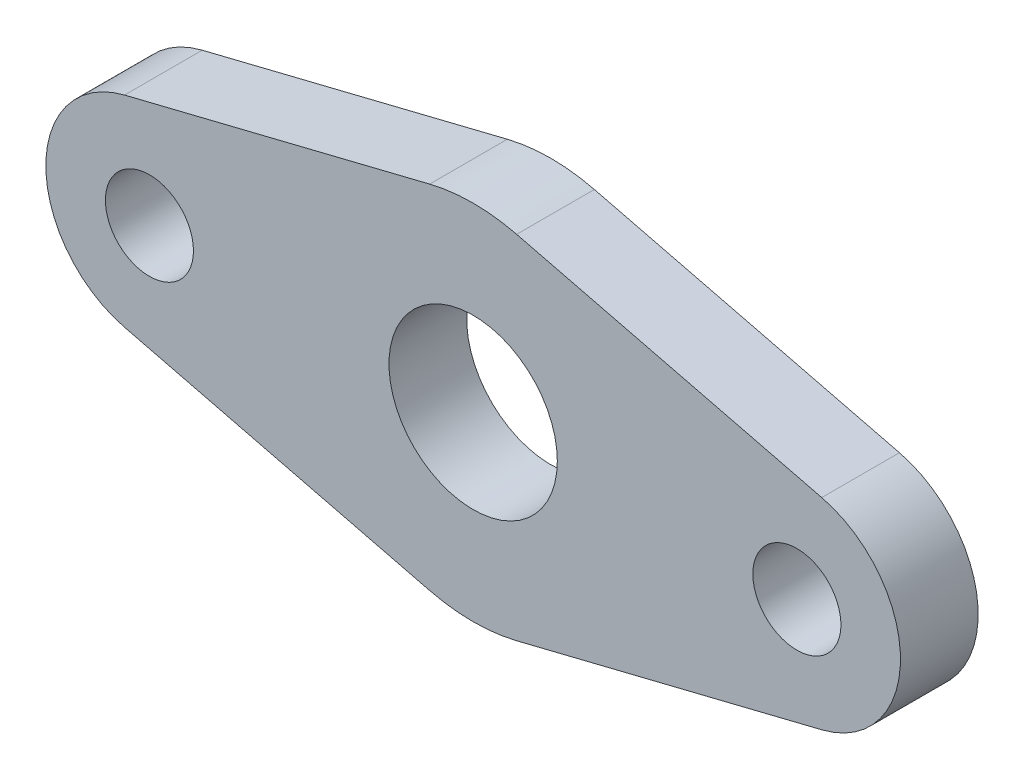
ISO-10303-21;
HEADER;
FILE_DESCRIPTION(('STEP AP214'),'2;1');
FILE_NAME('part.step','',(''),(''),'','','');
FILE_SCHEMA(('AUTOMOTIVE_DESIGN { 1 0 10303 214 1 1 1 1 }'));
ENDSEC;
DATA;
#1=APPLICATION_CONTEXT('core data for automotive mechanical design processes');
#2=APPLICATION_PROTOCOL_DEFINITION('international standard','automotive_design',2000,#1);
#3=PRODUCT_CONTEXT('',#1,'mechanical');
#4=PRODUCT('Part','Part','',(#3));
#5=PRODUCT_RELATED_PRODUCT_CATEGORY('part','',(#4));
#6=PRODUCT_DEFINITION_FORMATION('','',#4);
#7=PRODUCT_DEFINITION_CONTEXT('part definition',#1,'design');
#8=PRODUCT_DEFINITION('design','',#6,#7);
#9=PRODUCT_DEFINITION_SHAPE('','',#8);
#10=(LENGTH_UNIT() NAMED_UNIT(*) SI_UNIT(.MILLI.,.METRE.));
#11=(NAMED_UNIT(*) PLANE_ANGLE_UNIT() SI_UNIT($,.RADIAN.));
#12=(NAMED_UNIT(*) SI_UNIT($,.STERADIAN.) SOLID_ANGLE_UNIT());
#13=UNCERTAINTY_MEASURE_WITH_UNIT(LENGTH_MEASURE(1.E-05),#10,'distance_accuracy_value','');
#14=(GEOMETRIC_REPRESENTATION_CONTEXT(3) GLOBAL_UNCERTAINTY_ASSIGNED_CONTEXT((#13)) GLOBAL_UNIT_ASSIGNED_CONTEXT((#10,
#11,#12)) REPRESENTATION_CONTEXT('',''));
#15=CARTESIAN_POINT('',(0.,0.,0.));
#16=DIRECTION('',(0.,0.,1.));
#17=DIRECTION('',(1.,0.,0.));
#18=AXIS2_PLACEMENT_3D('',#15,#16,#17);
#19=CARTESIAN_POINT('',(-12.5,0.,3.));
#20=DIRECTION('',(0.,0.,1.));
#21=DIRECTION('',(1.,0.,0.));
#22=AXIS2_PLACEMENT_3D('',#19,#20,#21);
#23=PLANE('',#22);
#24=CARTESIAN_POINT('',(-12.5,0.,3.));
#25=DIRECTION('',(0.,0.,1.));
#26=DIRECTION('',(1.,0.,0.));
#27=AXIS2_PLACEMENT_3D('',#24,#25,#26);
#28=CIRCLE('',#27,1.7);
#29=CARTESIAN_POINT('',(-10.8,0.,3.));
#30=VERTEX_POINT('',#29);
#31=EDGE_CURVE('E213',#30,#30,#28,.T.);
#32=ORIENTED_EDGE('',*,*,#31,.F.);
#33=EDGE_LOOP('',(#32));
#34=FACE_BOUND('',#33,.T.);
#35=CARTESIAN_POINT('',(-12.5,0.,3.));
#36=DIRECTION('',(0.,0.,1.));
#37=DIRECTION('',(1.,0.,0.));
#38=AXIS2_PLACEMENT_3D('',#35,#36,#37);
#39=CIRCLE('',#38,3.99999999999999);
#40=CARTESIAN_POINT('',(-13.46,3.8830915518437,3.));
#41=VERTEX_POINT('',#40);
#42=CARTESIAN_POINT('',(-13.46,-3.8830915518437,3.));
#43=VERTEX_POINT('',#42);
#44=EDGE_CURVE('E164',#41,#43,#39,.T.);
#45=ORIENTED_EDGE('',*,*,#44,.T.);
#46=DIRECTION('',(0.970772887960928,-0.24,0.));
#47=VECTOR('',#46,1.);
#48=CARTESIAN_POINT('',(-13.46,-3.8830915518437,3.));
#49=LINE('',#48,#47);
#50=CARTESIAN_POINT('',(-1.68,-6.79541021572649,3.));
#51=VERTEX_POINT('',#50);
#52=EDGE_CURVE('E100',#43,#51,#49,.T.);
#53=ORIENTED_EDGE('',*,*,#52,.T.);
#54=CARTESIAN_POINT('',(0.,0.,3.));
#55=DIRECTION('',(0.,0.,1.));
#56=DIRECTION('',(-1.,0.,0.));
#57=AXIS2_PLACEMENT_3D('',#54,#55,#56);
#58=CIRCLE('',#57,7.);
#59=CARTESIAN_POINT('',(1.68,-6.79541021572649,3.));
#60=VERTEX_POINT('',#59);
#61=EDGE_CURVE('E185',#51,#60,#58,.T.);
#62=ORIENTED_EDGE('',*,*,#61,.T.);
#63=DIRECTION('',(0.970772887960928,0.240000000000001,0.));
#64=VECTOR('',#63,1.);
#65=CARTESIAN_POINT('',(13.46,-3.8830915518437,3.));
#66=LINE('',#65,#64);
#67=CARTESIAN_POINT('',(13.46,-3.8830915518437,3.));
#68=VERTEX_POINT('',#67);
#69=EDGE_CURVE('E199',#60,#68,#66,.T.);
#70=ORIENTED_EDGE('',*,*,#69,.T.);
#71=CARTESIAN_POINT('',(12.5,0.,3.));
#72=DIRECTION('',(0.,0.,1.));
#73=DIRECTION('',(-1.,0.,0.));
#74=AXIS2_PLACEMENT_3D('',#71,#72,#73);
#75=CIRCLE('',#74,3.99999999999999);
#76=CARTESIAN_POINT('',(13.46,3.8830915518437,3.));
#77=VERTEX_POINT('',#76);
#78=EDGE_CURVE('E119',#68,#77,#75,.T.);
#79=ORIENTED_EDGE('',*,*,#78,.T.);
#80=DIRECTION('',(-0.970772887960928,0.24,0.));
#81=VECTOR('',#80,1.);
#82=CARTESIAN_POINT('',(13.46,3.8830915518437,3.));
#83=LINE('',#82,#81);
#84=CARTESIAN_POINT('',(1.68,6.79541021572649,3.));
#85=VERTEX_POINT('',#84);
#86=EDGE_CURVE('E113',#77,#85,#83,.T.);
#87=ORIENTED_EDGE('',*,*,#86,.T.);
#88=CARTESIAN_POINT('',(0.,0.,3.));
#89=DIRECTION('',(0.,0.,1.));
#90=DIRECTION('',(1.,0.,0.));
#91=AXIS2_PLACEMENT_3D('',#88,#89,#90);
#92=CIRCLE('',#91,6.99999999999999);
#93=CARTESIAN_POINT('',(-1.68,6.79541021572649,3.));
#94=VERTEX_POINT('',#93);
#95=EDGE_CURVE('E117',#85,#94,#92,.T.);
#96=ORIENTED_EDGE('',*,*,#95,.T.);
#97=DIRECTION('',(-0.970772887960928,-0.24,0.));
#98=VECTOR('',#97,1.);
#99=CARTESIAN_POINT('',(-13.46,3.8830915518437,3.));
#100=LINE('',#99,#98);
#101=EDGE_CURVE('E57',#94,#41,#100,.T.);
#102=ORIENTED_EDGE('',*,*,#101,.T.);
#103=EDGE_LOOP('',(#45,#53,#62,#70,#79,#87,#96,#102));
#104=FACE_BOUND('',#103,.T.);
#105=CARTESIAN_POINT('',(0.,0.,3.));
#106=DIRECTION('',(0.,0.,1.));
#107=DIRECTION('',(1.,0.,0.));
#108=AXIS2_PLACEMENT_3D('',#105,#106,#107);
#109=CIRCLE('',#108,3.25);
#110=CARTESIAN_POINT('',(3.25,0.,3.));
#111=VERTEX_POINT('',#110);
#112=EDGE_CURVE('E146',#111,#111,#109,.T.);
#113=ORIENTED_EDGE('',*,*,#112,.F.);
#114=EDGE_LOOP('',(#113));
#115=FACE_BOUND('',#114,.T.);
#116=CARTESIAN_POINT('',(12.5,0.,3.));
#117=DIRECTION('',(0.,0.,1.));
#118=DIRECTION('',(-1.,0.,0.));
#119=AXIS2_PLACEMENT_3D('',#116,#117,#118);
#120=CIRCLE('',#119,1.7);
#121=CARTESIAN_POINT('',(10.8,0.,3.));
#122=VERTEX_POINT('',#121);
#123=EDGE_CURVE('E221',#122,#122,#120,.T.);
#124=ORIENTED_EDGE('',*,*,#123,.F.);
#125=EDGE_LOOP('',(#124));
#126=FACE_BOUND('',#125,.T.);
#127=ADVANCED_FACE('F39',(#34,#104,#115,#126),#23,.T.);
#128=CARTESIAN_POINT('',(-12.5,0.,0.));
#129=DIRECTION('',(0.,0.,1.));
#130=DIRECTION('',(1.,0.,0.));
#131=AXIS2_PLACEMENT_3D('',#128,#129,#130);
#132=PLANE('',#131);
#133=CARTESIAN_POINT('',(-12.5,0.,0.));
#134=DIRECTION('',(0.,0.,1.));
#135=DIRECTION('',(1.,0.,0.));
#136=AXIS2_PLACEMENT_3D('',#133,#134,#135);
#137=CIRCLE('',#136,3.99999999999999);
#138=CARTESIAN_POINT('',(-13.46,3.8830915518437,0.));
#139=VERTEX_POINT('',#138);
#140=CARTESIAN_POINT('',(-13.46,-3.8830915518437,0.));
#141=VERTEX_POINT('',#140);
#142=EDGE_CURVE('E141',#139,#141,#137,.T.);
#143=ORIENTED_EDGE('',*,*,#142,.F.);
#144=DIRECTION('',(-0.970772887960928,-0.24,0.));
#145=VECTOR('',#144,1.);
#146=CARTESIAN_POINT('',(-13.46,3.8830915518437,0.));
#147=LINE('',#146,#145);
#148=CARTESIAN_POINT('',(-1.68,6.79541021572649,0.));
#149=VERTEX_POINT('',#148);
#150=EDGE_CURVE('E92',#149,#139,#147,.T.);
#151=ORIENTED_EDGE('',*,*,#150,.F.);
#152=CARTESIAN_POINT('',(0.,0.,0.));
#153=DIRECTION('',(0.,0.,1.));
#154=DIRECTION('',(1.,0.,0.));
#155=AXIS2_PLACEMENT_3D('',#152,#153,#154);
#156=CIRCLE('',#155,6.99999999999999);
#157=CARTESIAN_POINT('',(1.68,6.79541021572649,0.));
#158=VERTEX_POINT('',#157);
#159=EDGE_CURVE('E86',#158,#149,#156,.T.);
#160=ORIENTED_EDGE('',*,*,#159,.F.);
#161=DIRECTION('',(-0.970772887960928,0.24,0.));
#162=VECTOR('',#161,1.);
#163=CARTESIAN_POINT('',(13.46,3.8830915518437,0.));
#164=LINE('',#163,#162);
#165=CARTESIAN_POINT('',(13.46,3.8830915518437,0.));
#166=VERTEX_POINT('',#165);
#167=EDGE_CURVE('E128',#166,#158,#164,.T.);
#168=ORIENTED_EDGE('',*,*,#167,.F.);
#169=CARTESIAN_POINT('',(12.5,0.,0.));
#170=DIRECTION('',(0.,0.,1.));
#171=DIRECTION('',(-1.,0.,0.));
#172=AXIS2_PLACEMENT_3D('',#169,#170,#171);
#173=CIRCLE('',#172,3.99999999999999);
#174=CARTESIAN_POINT('',(13.46,-3.8830915518437,0.));
#175=VERTEX_POINT('',#174);
#176=EDGE_CURVE('E155',#175,#166,#173,.T.);
#177=ORIENTED_EDGE('',*,*,#176,.F.);
#178=DIRECTION('',(0.970772887960928,0.240000000000001,0.));
#179=VECTOR('',#178,1.);
#180=CARTESIAN_POINT('',(13.46,-3.8830915518437,0.));
#181=LINE('',#180,#179);
#182=CARTESIAN_POINT('',(1.68,-6.79541021572649,0.));
#183=VERTEX_POINT('',#182);
#184=EDGE_CURVE('E152',#183,#175,#181,.T.);
#185=ORIENTED_EDGE('',*,*,#184,.F.);
#186=CARTESIAN_POINT('',(0.,0.,0.));
#187=DIRECTION('',(0.,0.,1.));
#188=DIRECTION('',(-1.,0.,0.));
#189=AXIS2_PLACEMENT_3D('',#186,#187,#188);
#190=CIRCLE('',#189,7.);
#191=CARTESIAN_POINT('',(-1.68,-6.79541021572649,0.));
#192=VERTEX_POINT('',#191);
#193=EDGE_CURVE('E149',#192,#183,#190,.T.);
#194=ORIENTED_EDGE('',*,*,#193,.F.);
#195=DIRECTION('',(0.970772887960928,-0.24,0.));
#196=VECTOR('',#195,1.);
#197=CARTESIAN_POINT('',(-13.46,-3.8830915518437,0.));
#198=LINE('',#197,#196);
#199=EDGE_CURVE('E145',#141,#192,#198,.T.);
#200=ORIENTED_EDGE('',*,*,#199,.F.);
#201=EDGE_LOOP('',(#143,#151,#160,#168,#177,#185,#194,#200));
#202=FACE_BOUND('',#201,.T.);
#203=CARTESIAN_POINT('',(0.,0.,0.));
#204=DIRECTION('',(0.,0.,1.));
#205=DIRECTION('',(1.,0.,0.));
#206=AXIS2_PLACEMENT_3D('',#203,#204,#205);
#207=CIRCLE('',#206,3.25);
#208=CARTESIAN_POINT('',(3.25,0.,0.));
#209=VERTEX_POINT('',#208);
#210=EDGE_CURVE('E209',#209,#209,#207,.T.);
#211=ORIENTED_EDGE('',*,*,#210,.T.);
#212=EDGE_LOOP('',(#211));
#213=FACE_BOUND('',#212,.T.);
#214=CARTESIAN_POINT('',(-12.5,0.,0.));
#215=DIRECTION('',(0.,0.,1.));
#216=DIRECTION('',(1.,0.,0.));
#217=AXIS2_PLACEMENT_3D('',#214,#215,#216);
#218=CIRCLE('',#217,1.7);
#219=CARTESIAN_POINT('',(-10.8,0.,0.));
#220=VERTEX_POINT('',#219);
#221=EDGE_CURVE('E217',#220,#220,#218,.T.);
#222=ORIENTED_EDGE('',*,*,#221,.T.);
#223=EDGE_LOOP('',(#222));
#224=FACE_BOUND('',#223,.T.);
#225=CARTESIAN_POINT('',(12.5,0.,0.));
#226=DIRECTION('',(0.,0.,1.));
#227=DIRECTION('',(-1.,0.,0.));
#228=AXIS2_PLACEMENT_3D('',#225,#226,#227);
#229=CIRCLE('',#228,1.7);
#230=CARTESIAN_POINT('',(10.8,0.,0.));
#231=VERTEX_POINT('',#230);
#232=EDGE_CURVE('E225',#231,#231,#229,.T.);
#233=ORIENTED_EDGE('',*,*,#232,.T.);
#234=EDGE_LOOP('',(#233));
#235=FACE_BOUND('',#234,.T.);
#236=ADVANCED_FACE('F189',(#202,#213,#224,#235),#132,.F.);
#237=CARTESIAN_POINT('',(-12.5,0.,3.));
#238=DIRECTION('',(0.,0.,-1.));
#239=DIRECTION('',(-1.,0.,0.));
#240=AXIS2_PLACEMENT_3D('',#237,#238,#239);
#241=CYLINDRICAL_SURFACE('',#240,3.99999999999999);
#242=ORIENTED_EDGE('',*,*,#142,.T.);
#243=DIRECTION('',(0.,0.,-1.));
#244=VECTOR('',#243,1.);
#245=CARTESIAN_POINT('',(-13.46,-3.8830915518437,3.));
#246=LINE('',#245,#244);
#247=EDGE_CURVE('E11',#43,#141,#246,.T.);
#248=ORIENTED_EDGE('',*,*,#247,.F.);
#249=ORIENTED_EDGE('',*,*,#44,.F.);
#250=DIRECTION('',(0.,0.,-1.));
#251=VECTOR('',#250,1.);
#252=CARTESIAN_POINT('',(-13.46,3.8830915518437,3.));
#253=LINE('',#252,#251);
#254=EDGE_CURVE('E137',#41,#139,#253,.T.);
#255=ORIENTED_EDGE('',*,*,#254,.T.);
#256=EDGE_LOOP('',(#242,#248,#249,#255));
#257=FACE_BOUND('',#256,.T.);
#258=ADVANCED_FACE('F41',(#257),#241,.T.);
#259=CARTESIAN_POINT('',(-13.46,-3.8830915518437,3.));
#260=DIRECTION('',(0.24,0.970772887960928,0.));
#261=DIRECTION('',(-0.970772887960928,0.24,0.));
#262=AXIS2_PLACEMENT_3D('',#259,#260,#261);
#263=PLANE('',#262);
#264=ORIENTED_EDGE('',*,*,#199,.T.);
#265=DIRECTION('',(0.,0.,-1.));
#266=VECTOR('',#265,1.);
#267=CARTESIAN_POINT('',(-1.68,-6.79541021572649,3.));
#268=LINE('',#267,#266);
#269=EDGE_CURVE('E49',#51,#192,#268,.T.);
#270=ORIENTED_EDGE('',*,*,#269,.F.);
#271=ORIENTED_EDGE('',*,*,#52,.F.);
#272=ORIENTED_EDGE('',*,*,#247,.T.);
#273=EDGE_LOOP('',(#264,#270,#271,#272));
#274=FACE_BOUND('',#273,.T.);
#275=ADVANCED_FACE('F260',(#274),#263,.F.);
#276=CARTESIAN_POINT('',(0.,0.,3.));
#277=DIRECTION('',(0.,0.,-1.));
#278=DIRECTION('',(-1.,0.,0.));
#279=AXIS2_PLACEMENT_3D('',#276,#277,#278);
#280=CYLINDRICAL_SURFACE('',#279,7.);
#281=ORIENTED_EDGE('',*,*,#193,.T.);
#282=DIRECTION('',(0.,0.,-1.));
#283=VECTOR('',#282,1.);
#284=CARTESIAN_POINT('',(1.68,-6.79541021572649,3.));
#285=LINE('',#284,#283);
#286=EDGE_CURVE('E175',#60,#183,#285,.T.);
#287=ORIENTED_EDGE('',*,*,#286,.F.);
#288=ORIENTED_EDGE('',*,*,#61,.F.);
#289=ORIENTED_EDGE('',*,*,#269,.T.);
#290=EDGE_LOOP('',(#281,#287,#288,#289));
#291=FACE_BOUND('',#290,.T.);
#292=ADVANCED_FACE('F183',(#291),#280,.T.);
#293=CARTESIAN_POINT('',(13.46,-3.8830915518437,3.));
#294=DIRECTION('',(-0.24,0.970772887960928,0.));
#295=DIRECTION('',(-0.970772887960928,-0.24,0.));
#296=AXIS2_PLACEMENT_3D('',#293,#294,#295);
#297=PLANE('',#296);
#298=ORIENTED_EDGE('',*,*,#184,.T.);
#299=DIRECTION('',(0.,0.,-1.));
#300=VECTOR('',#299,1.);
#301=CARTESIAN_POINT('',(13.46,-3.8830915518437,3.));
#302=LINE('',#301,#300);
#303=EDGE_CURVE('E171',#68,#175,#302,.T.);
#304=ORIENTED_EDGE('',*,*,#303,.F.);
#305=ORIENTED_EDGE('',*,*,#69,.F.);
#306=ORIENTED_EDGE('',*,*,#286,.T.);
#307=EDGE_LOOP('',(#298,#304,#305,#306));
#308=FACE_BOUND('',#307,.T.);
#309=ADVANCED_FACE('F194',(#308),#297,.F.);
#310=CARTESIAN_POINT('',(12.5,0.,3.));
#311=DIRECTION('',(0.,0.,-1.));
#312=DIRECTION('',(-1.,0.,0.));
#313=AXIS2_PLACEMENT_3D('',#310,#311,#312);
#314=CYLINDRICAL_SURFACE('',#313,3.99999999999999);
#315=ORIENTED_EDGE('',*,*,#176,.T.);
#316=DIRECTION('',(0.,0.,-1.));
#317=VECTOR('',#316,1.);
#318=CARTESIAN_POINT('',(13.46,3.8830915518437,3.));
#319=LINE('',#318,#317);
#320=EDGE_CURVE('E130',#77,#166,#319,.T.);
#321=ORIENTED_EDGE('',*,*,#320,.F.);
#322=ORIENTED_EDGE('',*,*,#78,.F.);
#323=ORIENTED_EDGE('',*,*,#303,.T.);
#324=EDGE_LOOP('',(#315,#321,#322,#323));
#325=FACE_BOUND('',#324,.T.);
#326=ADVANCED_FACE('F197',(#325),#314,.T.);
#327=CARTESIAN_POINT('',(13.46,3.8830915518437,3.));
#328=DIRECTION('',(-0.24,-0.970772887960928,0.));
#329=DIRECTION('',(0.970772887960928,-0.24,0.));
#330=AXIS2_PLACEMENT_3D('',#327,#328,#329);
#331=PLANE('',#330);
#332=ORIENTED_EDGE('',*,*,#167,.T.);
#333=DIRECTION('',(0.,0.,-1.));
#334=VECTOR('',#333,1.);
#335=CARTESIAN_POINT('',(1.68,6.79541021572649,3.));
#336=LINE('',#335,#334);
#337=EDGE_CURVE('E125',#85,#158,#336,.T.);
#338=ORIENTED_EDGE('',*,*,#337,.F.);
#339=ORIENTED_EDGE('',*,*,#86,.F.);
#340=ORIENTED_EDGE('',*,*,#320,.T.);
#341=EDGE_LOOP('',(#332,#338,#339,#340));
#342=FACE_BOUND('',#341,.T.);
#343=ADVANCED_FACE('F126',(#342),#331,.F.);
#344=CARTESIAN_POINT('',(0.,0.,3.));
#345=DIRECTION('',(0.,0.,-1.));
#346=DIRECTION('',(-1.,0.,0.));
#347=AXIS2_PLACEMENT_3D('',#344,#345,#346);
#348=CYLINDRICAL_SURFACE('',#347,6.99999999999999);
#349=ORIENTED_EDGE('',*,*,#159,.T.);
#350=DIRECTION('',(0.,0.,-1.));
#351=VECTOR('',#350,1.);
#352=CARTESIAN_POINT('',(-1.68,6.79541021572649,3.));
#353=LINE('',#352,#351);
#354=EDGE_CURVE('E131',#94,#149,#353,.T.);
#355=ORIENTED_EDGE('',*,*,#354,.F.);
#356=ORIENTED_EDGE('',*,*,#95,.F.);
#357=ORIENTED_EDGE('',*,*,#337,.T.);
#358=EDGE_LOOP('',(#349,#355,#356,#357));
#359=FACE_BOUND('',#358,.T.);
#360=ADVANCED_FACE('F133',(#359),#348,.T.);
#361=CARTESIAN_POINT('',(-13.46,3.8830915518437,3.));
#362=DIRECTION('',(0.24,-0.970772887960928,0.));
#363=DIRECTION('',(0.970772887960928,0.24,0.));
#364=AXIS2_PLACEMENT_3D('',#361,#362,#363);
#365=PLANE('',#364);
#366=ORIENTED_EDGE('',*,*,#150,.T.);
#367=ORIENTED_EDGE('',*,*,#254,.F.);
#368=ORIENTED_EDGE('',*,*,#101,.F.);
#369=ORIENTED_EDGE('',*,*,#354,.T.);
#370=EDGE_LOOP('',(#366,#367,#368,#369));
#371=FACE_BOUND('',#370,.T.);
#372=ADVANCED_FACE('F248',(#371),#365,.F.);
#373=CARTESIAN_POINT('',(0.,0.,3.));
#374=DIRECTION('',(0.,0.,-1.));
#375=DIRECTION('',(-1.,0.,0.));
#376=AXIS2_PLACEMENT_3D('',#373,#374,#375);
#377=CYLINDRICAL_SURFACE('',#376,3.25);
#378=ORIENTED_EDGE('',*,*,#112,.T.);
#379=EDGE_LOOP('',(#378));
#380=FACE_BOUND('',#379,.T.);
#381=ORIENTED_EDGE('',*,*,#210,.F.);
#382=EDGE_LOOP('',(#381));
#383=FACE_BOUND('',#382,.T.);
#384=ADVANCED_FACE('F245',(#380,#383),#377,.F.);
#385=CARTESIAN_POINT('',(-12.5,0.,3.));
#386=DIRECTION('',(0.,0.,-1.));
#387=DIRECTION('',(-1.,0.,0.));
#388=AXIS2_PLACEMENT_3D('',#385,#386,#387);
#389=CYLINDRICAL_SURFACE('',#388,1.7);
#390=ORIENTED_EDGE('',*,*,#31,.T.);
#391=EDGE_LOOP('',(#390));
#392=FACE_BOUND('',#391,.T.);
#393=ORIENTED_EDGE('',*,*,#221,.F.);
#394=EDGE_LOOP('',(#393));
#395=FACE_BOUND('',#394,.T.);
#396=ADVANCED_FACE('F324',(#392,#395),#389,.F.);
#397=CARTESIAN_POINT('',(12.5,0.,3.));
#398=DIRECTION('',(0.,0.,-1.));
#399=DIRECTION('',(-1.,0.,0.));
#400=AXIS2_PLACEMENT_3D('',#397,#398,#399);
#401=CYLINDRICAL_SURFACE('',#400,1.7);
#402=ORIENTED_EDGE('',*,*,#123,.T.);
#403=EDGE_LOOP('',(#402));
#404=FACE_BOUND('',#403,.T.);
#405=ORIENTED_EDGE('',*,*,#232,.F.);
#406=EDGE_LOOP('',(#405));
#407=FACE_BOUND('',#406,.T.);
#408=ADVANCED_FACE('F233',(#404,#407),#401,.F.);
#409=CLOSED_SHELL('',(#127,#236,#258,#275,#292,#309,#326,#343,#360,#372,#384,#396,#408));
#410=MANIFOLD_SOLID_BREP('B2',#409);
#411=ADVANCED_BREP_SHAPE_REPRESENTATION('',(#18,#410),#14);
#412=SHAPE_DEFINITION_REPRESENTATION(#9,#411);
ENDSEC;
END-ISO-10303-21;
